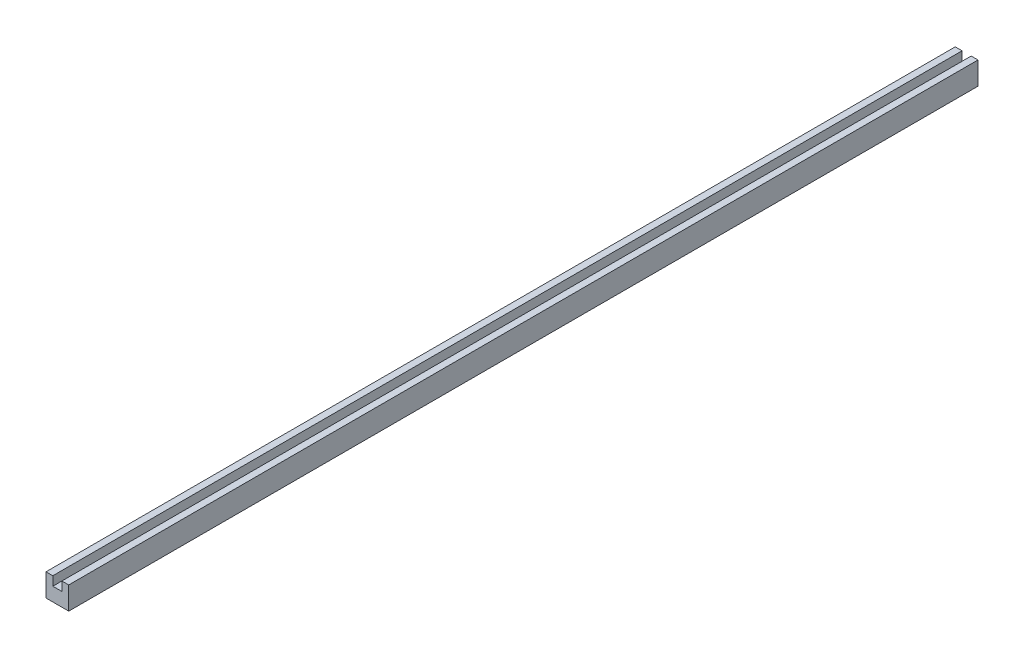
ISO-10303-21;
HEADER;
FILE_DESCRIPTION(('STEP AP214'),'2;1');
FILE_NAME('part.step','',(''),(''),'','','');
FILE_SCHEMA(('AUTOMOTIVE_DESIGN { 1 0 10303 214 1 1 1 1 }'));
ENDSEC;
DATA;
#1=APPLICATION_CONTEXT('core data for automotive mechanical design processes');
#2=APPLICATION_PROTOCOL_DEFINITION('international standard','automotive_design',2000,#1);
#3=PRODUCT_CONTEXT('',#1,'mechanical');
#4=PRODUCT('Part','Part','',(#3));
#5=PRODUCT_RELATED_PRODUCT_CATEGORY('part','',(#4));
#6=PRODUCT_DEFINITION_FORMATION('','',#4);
#7=PRODUCT_DEFINITION_CONTEXT('part definition',#1,'design');
#8=PRODUCT_DEFINITION('design','',#6,#7);
#9=PRODUCT_DEFINITION_SHAPE('','',#8);
#10=(LENGTH_UNIT() NAMED_UNIT(*) SI_UNIT(.MILLI.,.METRE.));
#11=(NAMED_UNIT(*) PLANE_ANGLE_UNIT() SI_UNIT($,.RADIAN.));
#12=(NAMED_UNIT(*) SI_UNIT($,.STERADIAN.) SOLID_ANGLE_UNIT());
#13=UNCERTAINTY_MEASURE_WITH_UNIT(LENGTH_MEASURE(1.E-05),#10,'distance_accuracy_value','');
#14=(GEOMETRIC_REPRESENTATION_CONTEXT(3) GLOBAL_UNCERTAINTY_ASSIGNED_CONTEXT((#13)) GLOBAL_UNIT_ASSIGNED_CONTEXT((#10,
#11,#12)) REPRESENTATION_CONTEXT('',''));
#15=CARTESIAN_POINT('',(0.,0.,0.));
#16=DIRECTION('',(0.,0.,1.));
#17=DIRECTION('',(1.,0.,0.));
#18=AXIS2_PLACEMENT_3D('',#15,#16,#17);
#19=CARTESIAN_POINT('',(0.,14.973544973545,-2000.));
#20=DIRECTION('',(0.,-1.,0.));
#21=DIRECTION('',(0.,0.,-1.));
#22=AXIS2_PLACEMENT_3D('',#19,#20,#21);
#23=PLANE('',#22);
#24=DIRECTION('',(1.,0.,0.));
#25=VECTOR('',#24,1.);
#26=CARTESIAN_POINT('',(0.,14.973544973545,0.));
#27=LINE('',#26,#25);
#28=CARTESIAN_POINT('',(14.2857142857143,14.973544973545,0.));
#29=VERTEX_POINT('',#28);
#30=CARTESIAN_POINT('',(29.2857142857143,14.973544973545,0.));
#31=VERTEX_POINT('',#30);
#32=EDGE_CURVE('E134',#29,#31,#27,.T.);
#33=ORIENTED_EDGE('',*,*,#32,.T.);
#34=DIRECTION('',(0.,0.,1.));
#35=VECTOR('',#34,1.);
#36=CARTESIAN_POINT('',(29.2857142857143,14.973544973545,-2000.));
#37=LINE('',#36,#35);
#38=CARTESIAN_POINT('',(29.2857142857143,14.973544973545,-2000.));
#39=VERTEX_POINT('',#38);
#40=EDGE_CURVE('E11',#39,#31,#37,.T.);
#41=ORIENTED_EDGE('',*,*,#40,.F.);
#42=DIRECTION('',(1.,0.,0.));
#43=VECTOR('',#42,1.);
#44=CARTESIAN_POINT('',(0.,14.973544973545,-2000.));
#45=LINE('',#44,#43);
#46=CARTESIAN_POINT('',(14.2857142857143,14.973544973545,-2000.));
#47=VERTEX_POINT('',#46);
#48=EDGE_CURVE('E129',#47,#39,#45,.T.);
#49=ORIENTED_EDGE('',*,*,#48,.F.);
#50=DIRECTION('',(0.,0.,1.));
#51=VECTOR('',#50,1.);
#52=CARTESIAN_POINT('',(14.2857142857143,14.973544973545,-2000.));
#53=LINE('',#52,#51);
#54=EDGE_CURVE('E39',#47,#29,#53,.T.);
#55=ORIENTED_EDGE('',*,*,#54,.T.);
#56=EDGE_LOOP('',(#33,#41,#49,#55));
#57=FACE_BOUND('',#56,.T.);
#58=ADVANCED_FACE('F35',(#57),#23,.F.);
#59=CARTESIAN_POINT('',(29.2857142857143,0.,-2000.));
#60=DIRECTION('',(-1.,0.,0.));
#61=DIRECTION('',(0.,-1.,0.));
#62=AXIS2_PLACEMENT_3D('',#59,#60,#61);
#63=PLANE('',#62);
#64=DIRECTION('',(0.,-1.,0.));
#65=VECTOR('',#64,1.);
#66=CARTESIAN_POINT('',(29.2857142857143,0.,0.));
#67=LINE('',#66,#65);
#68=CARTESIAN_POINT('',(29.2857142857143,-35.026455026455,0.));
#69=VERTEX_POINT('',#68);
#70=EDGE_CURVE('E87',#31,#69,#67,.T.);
#71=ORIENTED_EDGE('',*,*,#70,.T.);
#72=DIRECTION('',(0.,0.,1.));
#73=VECTOR('',#72,1.);
#74=CARTESIAN_POINT('',(29.2857142857143,-35.026455026455,-2000.));
#75=LINE('',#74,#73);
#76=CARTESIAN_POINT('',(29.2857142857143,-35.026455026455,-2000.));
#77=VERTEX_POINT('',#76);
#78=EDGE_CURVE('E45',#77,#69,#75,.T.);
#79=ORIENTED_EDGE('',*,*,#78,.F.);
#80=DIRECTION('',(0.,-1.,0.));
#81=VECTOR('',#80,1.);
#82=CARTESIAN_POINT('',(29.2857142857143,0.,-2000.));
#83=LINE('',#82,#81);
#84=EDGE_CURVE('E53',#39,#77,#83,.T.);
#85=ORIENTED_EDGE('',*,*,#84,.F.);
#86=ORIENTED_EDGE('',*,*,#40,.T.);
#87=EDGE_LOOP('',(#71,#79,#85,#86));
#88=FACE_BOUND('',#87,.T.);
#89=ADVANCED_FACE('F174',(#88),#63,.F.);
#90=CARTESIAN_POINT('',(0.,-35.026455026455,-2000.));
#91=DIRECTION('',(0.,-1.,0.));
#92=DIRECTION('',(1.,0.,0.));
#93=AXIS2_PLACEMENT_3D('',#90,#91,#92);
#94=PLANE('',#93);
#95=DIRECTION('',(1.,0.,0.));
#96=VECTOR('',#95,1.);
#97=CARTESIAN_POINT('',(0.,-35.026455026455,0.));
#98=LINE('',#97,#96);
#99=CARTESIAN_POINT('',(-20.7142857142857,-35.026455026455,0.));
#100=VERTEX_POINT('',#99);
#101=EDGE_CURVE('E111',#100,#69,#98,.T.);
#102=ORIENTED_EDGE('',*,*,#101,.F.);
#103=DIRECTION('',(0.,0.,1.));
#104=VECTOR('',#103,1.);
#105=CARTESIAN_POINT('',(-20.7142857142857,-35.026455026455,-2000.));
#106=LINE('',#105,#104);
#107=CARTESIAN_POINT('',(-20.7142857142857,-35.026455026455,-2000.));
#108=VERTEX_POINT('',#107);
#109=EDGE_CURVE('E107',#108,#100,#106,.T.);
#110=ORIENTED_EDGE('',*,*,#109,.F.);
#111=DIRECTION('',(1.,0.,0.));
#112=VECTOR('',#111,1.);
#113=CARTESIAN_POINT('',(0.,-35.026455026455,-2000.));
#114=LINE('',#113,#112);
#115=EDGE_CURVE('E110',#108,#77,#114,.T.);
#116=ORIENTED_EDGE('',*,*,#115,.T.);
#117=ORIENTED_EDGE('',*,*,#78,.T.);
#118=EDGE_LOOP('',(#102,#110,#116,#117));
#119=FACE_BOUND('',#118,.T.);
#120=ADVANCED_FACE('F109',(#119),#94,.T.);
#121=CARTESIAN_POINT('',(-20.7142857142857,0.,-2000.));
#122=DIRECTION('',(-1.,0.,0.));
#123=DIRECTION('',(0.,-1.,0.));
#124=AXIS2_PLACEMENT_3D('',#121,#122,#123);
#125=PLANE('',#124);
#126=DIRECTION('',(0.,-1.,0.));
#127=VECTOR('',#126,1.);
#128=CARTESIAN_POINT('',(-20.7142857142857,0.,0.));
#129=LINE('',#128,#127);
#130=CARTESIAN_POINT('',(-20.7142857142857,14.973544973545,0.));
#131=VERTEX_POINT('',#130);
#132=EDGE_CURVE('E146',#131,#100,#129,.T.);
#133=ORIENTED_EDGE('',*,*,#132,.F.);
#134=DIRECTION('',(0.,0.,1.));
#135=VECTOR('',#134,1.);
#136=CARTESIAN_POINT('',(-20.7142857142857,14.973544973545,-2000.));
#137=LINE('',#136,#135);
#138=CARTESIAN_POINT('',(-20.7142857142857,14.973544973545,-2000.));
#139=VERTEX_POINT('',#138);
#140=EDGE_CURVE('E116',#139,#131,#137,.T.);
#141=ORIENTED_EDGE('',*,*,#140,.F.);
#142=DIRECTION('',(0.,-1.,0.));
#143=VECTOR('',#142,1.);
#144=CARTESIAN_POINT('',(-20.7142857142857,0.,-2000.));
#145=LINE('',#144,#143);
#146=EDGE_CURVE('E121',#139,#108,#145,.T.);
#147=ORIENTED_EDGE('',*,*,#146,.T.);
#148=ORIENTED_EDGE('',*,*,#109,.T.);
#149=EDGE_LOOP('',(#133,#141,#147,#148));
#150=FACE_BOUND('',#149,.T.);
#151=ADVANCED_FACE('F123',(#150),#125,.T.);
#152=CARTESIAN_POINT('',(-5.71428571428569,14.973544973545,0.));
#153=VERTEX_POINT('',#152);
#154=EDGE_CURVE('E138',#131,#153,#27,.T.);
#155=ORIENTED_EDGE('',*,*,#154,.T.);
#156=DIRECTION('',(0.,0.,1.));
#157=VECTOR('',#156,1.);
#158=CARTESIAN_POINT('',(-5.71428571428569,14.973544973545,-2000.));
#159=LINE('',#158,#157);
#160=CARTESIAN_POINT('',(-5.71428571428569,14.973544973545,-2000.));
#161=VERTEX_POINT('',#160);
#162=EDGE_CURVE('E152',#161,#153,#159,.T.);
#163=ORIENTED_EDGE('',*,*,#162,.F.);
#164=EDGE_CURVE('E125',#139,#161,#45,.T.);
#165=ORIENTED_EDGE('',*,*,#164,.F.);
#166=ORIENTED_EDGE('',*,*,#140,.T.);
#167=EDGE_LOOP('',(#155,#163,#165,#166));
#168=FACE_BOUND('',#167,.T.);
#169=ADVANCED_FACE('F176',(#168),#23,.F.);
#170=CARTESIAN_POINT('',(-5.71428571428569,0.,-2000.));
#171=DIRECTION('',(-1.,0.,0.));
#172=DIRECTION('',(0.,-1.,0.));
#173=AXIS2_PLACEMENT_3D('',#170,#171,#172);
#174=PLANE('',#173);
#175=DIRECTION('',(0.,-1.,0.));
#176=VECTOR('',#175,1.);
#177=CARTESIAN_POINT('',(-5.71428571428569,0.,0.));
#178=LINE('',#177,#176);
#179=CARTESIAN_POINT('',(-5.71428571428569,-5.02645502645503,0.));
#180=VERTEX_POINT('',#179);
#181=EDGE_CURVE('E144',#153,#180,#178,.T.);
#182=ORIENTED_EDGE('',*,*,#181,.T.);
#183=DIRECTION('',(0.,0.,1.));
#184=VECTOR('',#183,1.);
#185=CARTESIAN_POINT('',(-5.71428571428569,-5.02645502645503,-2000.));
#186=LINE('',#185,#184);
#187=CARTESIAN_POINT('',(-5.71428571428569,-5.02645502645503,-2000.));
#188=VERTEX_POINT('',#187);
#189=EDGE_CURVE('E155',#188,#180,#186,.T.);
#190=ORIENTED_EDGE('',*,*,#189,.F.);
#191=DIRECTION('',(0.,-1.,0.));
#192=VECTOR('',#191,1.);
#193=CARTESIAN_POINT('',(-5.71428571428569,0.,-2000.));
#194=LINE('',#193,#192);
#195=EDGE_CURVE('E127',#161,#188,#194,.T.);
#196=ORIENTED_EDGE('',*,*,#195,.F.);
#197=ORIENTED_EDGE('',*,*,#162,.T.);
#198=EDGE_LOOP('',(#182,#190,#196,#197));
#199=FACE_BOUND('',#198,.T.);
#200=ADVANCED_FACE('F171',(#199),#174,.F.);
#201=CARTESIAN_POINT('',(0.,-5.02645502645503,-2000.));
#202=DIRECTION('',(0.,-1.,0.));
#203=DIRECTION('',(0.,0.,-1.));
#204=AXIS2_PLACEMENT_3D('',#201,#202,#203);
#205=PLANE('',#204);
#206=DIRECTION('',(1.,0.,0.));
#207=VECTOR('',#206,1.);
#208=CARTESIAN_POINT('',(0.,-5.02645502645503,0.));
#209=LINE('',#208,#207);
#210=CARTESIAN_POINT('',(14.2857142857143,-5.02645502645503,0.));
#211=VERTEX_POINT('',#210);
#212=EDGE_CURVE('E141',#180,#211,#209,.T.);
#213=ORIENTED_EDGE('',*,*,#212,.T.);
#214=DIRECTION('',(0.,0.,1.));
#215=VECTOR('',#214,1.);
#216=CARTESIAN_POINT('',(14.2857142857143,-5.02645502645503,-2000.));
#217=LINE('',#216,#215);
#218=CARTESIAN_POINT('',(14.2857142857143,-5.02645502645503,-2000.));
#219=VERTEX_POINT('',#218);
#220=EDGE_CURVE('E157',#219,#211,#217,.T.);
#221=ORIENTED_EDGE('',*,*,#220,.F.);
#222=DIRECTION('',(1.,0.,0.));
#223=VECTOR('',#222,1.);
#224=CARTESIAN_POINT('',(0.,-5.02645502645503,-2000.));
#225=LINE('',#224,#223);
#226=EDGE_CURVE('E196',#188,#219,#225,.T.);
#227=ORIENTED_EDGE('',*,*,#226,.F.);
#228=ORIENTED_EDGE('',*,*,#189,.T.);
#229=EDGE_LOOP('',(#213,#221,#227,#228));
#230=FACE_BOUND('',#229,.T.);
#231=ADVANCED_FACE('F165',(#230),#205,.F.);
#232=CARTESIAN_POINT('',(14.2857142857143,0.,-2000.));
#233=DIRECTION('',(-1.,0.,0.));
#234=DIRECTION('',(0.,0.,1.));
#235=AXIS2_PLACEMENT_3D('',#232,#233,#234);
#236=PLANE('',#235);
#237=DIRECTION('',(0.,-1.,0.));
#238=VECTOR('',#237,1.);
#239=CARTESIAN_POINT('',(14.2857142857143,0.,0.));
#240=LINE('',#239,#238);
#241=EDGE_CURVE('E137',#29,#211,#240,.T.);
#242=ORIENTED_EDGE('',*,*,#241,.F.);
#243=ORIENTED_EDGE('',*,*,#54,.F.);
#244=DIRECTION('',(0.,-1.,0.));
#245=VECTOR('',#244,1.);
#246=CARTESIAN_POINT('',(14.2857142857143,0.,-2000.));
#247=LINE('',#246,#245);
#248=EDGE_CURVE('E197',#47,#219,#247,.T.);
#249=ORIENTED_EDGE('',*,*,#248,.T.);
#250=ORIENTED_EDGE('',*,*,#220,.T.);
#251=EDGE_LOOP('',(#242,#243,#249,#250));
#252=FACE_BOUND('',#251,.T.);
#253=ADVANCED_FACE('F37',(#252),#236,.T.);
#254=CARTESIAN_POINT('',(0.,0.,-2000.));
#255=DIRECTION('',(0.,0.,1.));
#256=DIRECTION('',(1.,0.,0.));
#257=AXIS2_PLACEMENT_3D('',#254,#255,#256);
#258=PLANE('',#257);
#259=ORIENTED_EDGE('',*,*,#48,.T.);
#260=ORIENTED_EDGE('',*,*,#84,.T.);
#261=ORIENTED_EDGE('',*,*,#115,.F.);
#262=ORIENTED_EDGE('',*,*,#146,.F.);
#263=ORIENTED_EDGE('',*,*,#164,.T.);
#264=ORIENTED_EDGE('',*,*,#195,.T.);
#265=ORIENTED_EDGE('',*,*,#226,.T.);
#266=ORIENTED_EDGE('',*,*,#248,.F.);
#267=EDGE_LOOP('',(#259,#260,#261,#262,#263,#264,#265,#266));
#268=FACE_BOUND('',#267,.T.);
#269=ADVANCED_FACE('F120',(#268),#258,.F.);
#270=CARTESIAN_POINT('',(0.,0.,0.));
#271=DIRECTION('',(0.,0.,1.));
#272=DIRECTION('',(1.,0.,0.));
#273=AXIS2_PLACEMENT_3D('',#270,#271,#272);
#274=PLANE('',#273);
#275=ORIENTED_EDGE('',*,*,#32,.F.);
#276=ORIENTED_EDGE('',*,*,#241,.T.);
#277=ORIENTED_EDGE('',*,*,#212,.F.);
#278=ORIENTED_EDGE('',*,*,#181,.F.);
#279=ORIENTED_EDGE('',*,*,#154,.F.);
#280=ORIENTED_EDGE('',*,*,#132,.T.);
#281=ORIENTED_EDGE('',*,*,#101,.T.);
#282=ORIENTED_EDGE('',*,*,#70,.F.);
#283=EDGE_LOOP('',(#275,#276,#277,#278,#279,#280,#281,#282));
#284=FACE_BOUND('',#283,.T.);
#285=ADVANCED_FACE('F162',(#284),#274,.T.);
#286=CLOSED_SHELL('',(#58,#89,#120,#151,#169,#200,#231,#253,#269,#285));
#287=MANIFOLD_SOLID_BREP('B2',#286);
#288=ADVANCED_BREP_SHAPE_REPRESENTATION('',(#18,#287),#14);
#289=SHAPE_DEFINITION_REPRESENTATION(#9,#288);
ENDSEC;
END-ISO-10303-21;
